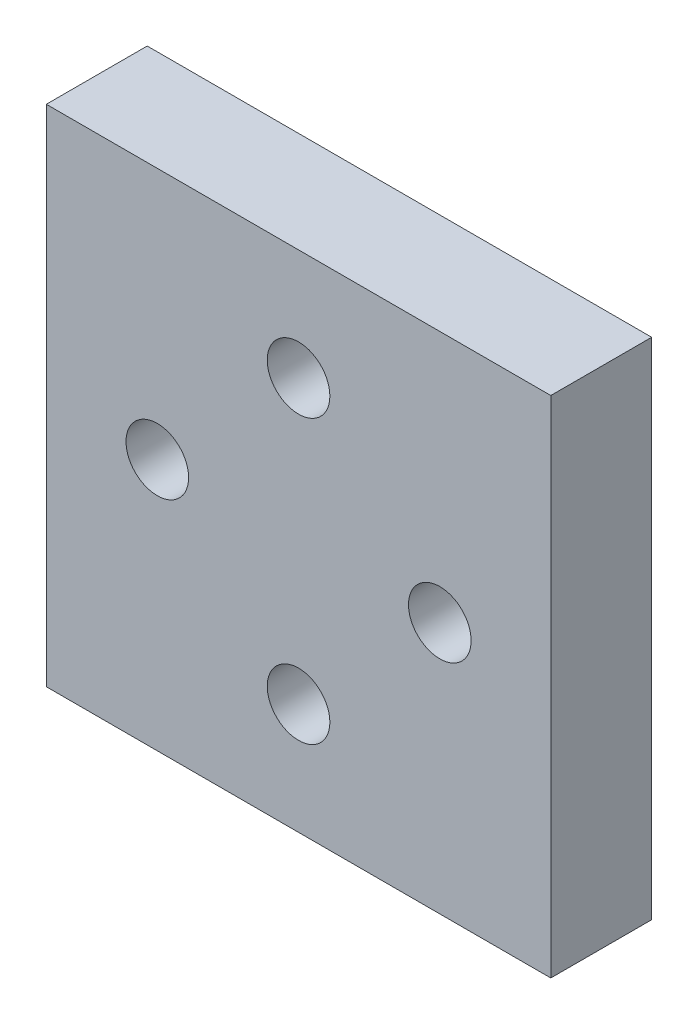
ISO-10303-21;
HEADER;
FILE_DESCRIPTION(('STEP AP214'),'2;1');
FILE_NAME('part.step','',(''),(''),'','','');
FILE_SCHEMA(('AUTOMOTIVE_DESIGN { 1 0 10303 214 1 1 1 1 }'));
ENDSEC;
DATA;
#1=APPLICATION_CONTEXT('core data for automotive mechanical design processes');
#2=APPLICATION_PROTOCOL_DEFINITION('international standard','automotive_design',2000,#1);
#3=PRODUCT_CONTEXT('',#1,'mechanical');
#4=PRODUCT('Part','Part','',(#3));
#5=PRODUCT_RELATED_PRODUCT_CATEGORY('part','',(#4));
#6=PRODUCT_DEFINITION_FORMATION('','',#4);
#7=PRODUCT_DEFINITION_CONTEXT('part definition',#1,'design');
#8=PRODUCT_DEFINITION('design','',#6,#7);
#9=PRODUCT_DEFINITION_SHAPE('','',#8);
#10=(LENGTH_UNIT() NAMED_UNIT(*) SI_UNIT(.MILLI.,.METRE.));
#11=(NAMED_UNIT(*) PLANE_ANGLE_UNIT() SI_UNIT($,.RADIAN.));
#12=(NAMED_UNIT(*) SI_UNIT($,.STERADIAN.) SOLID_ANGLE_UNIT());
#13=UNCERTAINTY_MEASURE_WITH_UNIT(LENGTH_MEASURE(1.E-05),#10,'distance_accuracy_value','');
#14=(GEOMETRIC_REPRESENTATION_CONTEXT(3) GLOBAL_UNCERTAINTY_ASSIGNED_CONTEXT((#13)) GLOBAL_UNIT_ASSIGNED_CONTEXT((#10,
#11,#12)) REPRESENTATION_CONTEXT('',''));
#15=CARTESIAN_POINT('',(0.,0.,0.));
#16=DIRECTION('',(0.,0.,1.));
#17=DIRECTION('',(1.,0.,0.));
#18=AXIS2_PLACEMENT_3D('',#15,#16,#17);
#19=CARTESIAN_POINT('',(0.,0.,5.));
#20=DIRECTION('',(0.,0.,1.));
#21=DIRECTION('',(1.,0.,0.));
#22=AXIS2_PLACEMENT_3D('',#19,#20,#21);
#23=PLANE('',#22);
#24=CARTESIAN_POINT('',(5.94427015220175E-13,-7.,5.));
#25=DIRECTION('',(0.,0.,1.));
#26=DIRECTION('',(1.,0.,0.));
#27=AXIS2_PLACEMENT_3D('',#24,#25,#26);
#28=CIRCLE('',#27,1.55153704903769);
#29=CARTESIAN_POINT('',(1.55153704903828,-7.,5.));
#30=VERTEX_POINT('',#29);
#31=EDGE_CURVE('E121',#30,#30,#28,.T.);
#32=ORIENTED_EDGE('',*,*,#31,.F.);
#33=EDGE_LOOP('',(#32));
#34=FACE_BOUND('',#33,.T.);
#35=CARTESIAN_POINT('',(0.,7.,5.));
#36=DIRECTION('',(0.,0.,1.));
#37=DIRECTION('',(1.,0.,0.));
#38=AXIS2_PLACEMENT_3D('',#35,#36,#37);
#39=CIRCLE('',#38,1.55153704903707);
#40=CARTESIAN_POINT('',(1.55153704903707,7.,5.));
#41=VERTEX_POINT('',#40);
#42=EDGE_CURVE('E100',#41,#41,#39,.T.);
#43=ORIENTED_EDGE('',*,*,#42,.F.);
#44=EDGE_LOOP('',(#43));
#45=FACE_BOUND('',#44,.T.);
#46=DIRECTION('',(0.,1.,0.));
#47=VECTOR('',#46,1.);
#48=CARTESIAN_POINT('',(12.5,12.5,5.));
#49=LINE('',#48,#47);
#50=CARTESIAN_POINT('',(12.5,-12.5,5.));
#51=VERTEX_POINT('',#50);
#52=CARTESIAN_POINT('',(12.5,12.5,5.));
#53=VERTEX_POINT('',#52);
#54=EDGE_CURVE('E85',#51,#53,#49,.T.);
#55=ORIENTED_EDGE('',*,*,#54,.T.);
#56=DIRECTION('',(-1.,0.,0.));
#57=VECTOR('',#56,1.);
#58=CARTESIAN_POINT('',(-12.5,12.5,5.));
#59=LINE('',#58,#57);
#60=CARTESIAN_POINT('',(-12.5,12.5,5.));
#61=VERTEX_POINT('',#60);
#62=EDGE_CURVE('E80',#53,#61,#59,.T.);
#63=ORIENTED_EDGE('',*,*,#62,.T.);
#64=DIRECTION('',(0.,-1.,0.));
#65=VECTOR('',#64,1.);
#66=CARTESIAN_POINT('',(-12.5,12.5,5.));
#67=LINE('',#66,#65);
#68=CARTESIAN_POINT('',(-12.5,-12.5,5.));
#69=VERTEX_POINT('',#68);
#70=EDGE_CURVE('E83',#61,#69,#67,.T.);
#71=ORIENTED_EDGE('',*,*,#70,.T.);
#72=DIRECTION('',(1.,0.,0.));
#73=VECTOR('',#72,1.);
#74=CARTESIAN_POINT('',(-12.5,-12.5,5.));
#75=LINE('',#74,#73);
#76=EDGE_CURVE('E50',#69,#51,#75,.T.);
#77=ORIENTED_EDGE('',*,*,#76,.T.);
#78=EDGE_LOOP('',(#55,#63,#71,#77));
#79=FACE_BOUND('',#78,.T.);
#80=CARTESIAN_POINT('',(7.0000000000003,2.97142069880137E-13,5.));
#81=DIRECTION('',(0.,0.,1.));
#82=DIRECTION('',(1.,0.,0.));
#83=AXIS2_PLACEMENT_3D('',#80,#81,#82);
#84=CIRCLE('',#83,1.55153704903729);
#85=CARTESIAN_POINT('',(8.55153704903759,2.97142069880137E-13,5.));
#86=VERTEX_POINT('',#85);
#87=EDGE_CURVE('E115',#86,#86,#84,.T.);
#88=ORIENTED_EDGE('',*,*,#87,.F.);
#89=EDGE_LOOP('',(#88));
#90=FACE_BOUND('',#89,.T.);
#91=CARTESIAN_POINT('',(-6.9999999999997,-2.97999322639541E-13,5.));
#92=DIRECTION('',(0.,0.,1.));
#93=DIRECTION('',(1.,0.,0.));
#94=AXIS2_PLACEMENT_3D('',#91,#92,#93);
#95=CIRCLE('',#94,1.55153704903751);
#96=CARTESIAN_POINT('',(-5.44846295096219,-2.97999322639541E-13,5.));
#97=VERTEX_POINT('',#96);
#98=EDGE_CURVE('E127',#97,#97,#95,.T.);
#99=ORIENTED_EDGE('',*,*,#98,.F.);
#100=EDGE_LOOP('',(#99));
#101=FACE_BOUND('',#100,.T.);
#102=ADVANCED_FACE('F33',(#34,#45,#79,#90,#101),#23,.T.);
#103=CARTESIAN_POINT('',(0.,0.,0.));
#104=DIRECTION('',(0.,0.,1.));
#105=DIRECTION('',(1.,0.,0.));
#106=AXIS2_PLACEMENT_3D('',#103,#104,#105);
#107=PLANE('',#106);
#108=DIRECTION('',(0.,1.,0.));
#109=VECTOR('',#108,1.);
#110=CARTESIAN_POINT('',(12.5,12.5,0.));
#111=LINE('',#110,#109);
#112=CARTESIAN_POINT('',(12.5,-12.5,0.));
#113=VERTEX_POINT('',#112);
#114=CARTESIAN_POINT('',(12.5,12.5,0.));
#115=VERTEX_POINT('',#114);
#116=EDGE_CURVE('E97',#113,#115,#111,.T.);
#117=ORIENTED_EDGE('',*,*,#116,.F.);
#118=DIRECTION('',(1.,0.,0.));
#119=VECTOR('',#118,1.);
#120=CARTESIAN_POINT('',(-12.5,-12.5,0.));
#121=LINE('',#120,#119);
#122=CARTESIAN_POINT('',(-12.5,-12.5,0.));
#123=VERTEX_POINT('',#122);
#124=EDGE_CURVE('E73',#123,#113,#121,.T.);
#125=ORIENTED_EDGE('',*,*,#124,.F.);
#126=DIRECTION('',(0.,-1.,0.));
#127=VECTOR('',#126,1.);
#128=CARTESIAN_POINT('',(-12.5,12.5,0.));
#129=LINE('',#128,#127);
#130=CARTESIAN_POINT('',(-12.5,12.5,0.));
#131=VERTEX_POINT('',#130);
#132=EDGE_CURVE('E67',#131,#123,#129,.T.);
#133=ORIENTED_EDGE('',*,*,#132,.F.);
#134=DIRECTION('',(-1.,0.,0.));
#135=VECTOR('',#134,1.);
#136=CARTESIAN_POINT('',(-12.5,12.5,0.));
#137=LINE('',#136,#135);
#138=EDGE_CURVE('E89',#115,#131,#137,.T.);
#139=ORIENTED_EDGE('',*,*,#138,.F.);
#140=EDGE_LOOP('',(#117,#125,#133,#139));
#141=FACE_BOUND('',#140,.T.);
#142=CARTESIAN_POINT('',(0.,7.,0.));
#143=DIRECTION('',(0.,0.,1.));
#144=DIRECTION('',(1.,0.,0.));
#145=AXIS2_PLACEMENT_3D('',#142,#143,#144);
#146=CIRCLE('',#145,1.55153704903707);
#147=CARTESIAN_POINT('',(1.55153704903707,7.,0.));
#148=VERTEX_POINT('',#147);
#149=EDGE_CURVE('E112',#148,#148,#146,.T.);
#150=ORIENTED_EDGE('',*,*,#149,.T.);
#151=EDGE_LOOP('',(#150));
#152=FACE_BOUND('',#151,.T.);
#153=CARTESIAN_POINT('',(7.0000000000003,2.97142069880137E-13,0.));
#154=DIRECTION('',(0.,0.,1.));
#155=DIRECTION('',(1.,0.,0.));
#156=AXIS2_PLACEMENT_3D('',#153,#154,#155);
#157=CIRCLE('',#156,1.55153704903729);
#158=CARTESIAN_POINT('',(8.55153704903759,2.97142069880137E-13,0.));
#159=VERTEX_POINT('',#158);
#160=EDGE_CURVE('E118',#159,#159,#157,.T.);
#161=ORIENTED_EDGE('',*,*,#160,.T.);
#162=EDGE_LOOP('',(#161));
#163=FACE_BOUND('',#162,.T.);
#164=CARTESIAN_POINT('',(5.94427015220175E-13,-7.,0.));
#165=DIRECTION('',(0.,0.,1.));
#166=DIRECTION('',(1.,0.,0.));
#167=AXIS2_PLACEMENT_3D('',#164,#165,#166);
#168=CIRCLE('',#167,1.55153704903769);
#169=CARTESIAN_POINT('',(1.55153704903828,-7.,0.));
#170=VERTEX_POINT('',#169);
#171=EDGE_CURVE('E124',#170,#170,#168,.T.);
#172=ORIENTED_EDGE('',*,*,#171,.T.);
#173=EDGE_LOOP('',(#172));
#174=FACE_BOUND('',#173,.T.);
#175=CARTESIAN_POINT('',(-6.9999999999997,-2.97999322639541E-13,0.));
#176=DIRECTION('',(0.,0.,1.));
#177=DIRECTION('',(1.,0.,0.));
#178=AXIS2_PLACEMENT_3D('',#175,#176,#177);
#179=CIRCLE('',#178,1.55153704903751);
#180=CARTESIAN_POINT('',(-5.44846295096219,-2.97999322639541E-13,0.));
#181=VERTEX_POINT('',#180);
#182=EDGE_CURVE('E130',#181,#181,#179,.T.);
#183=ORIENTED_EDGE('',*,*,#182,.T.);
#184=EDGE_LOOP('',(#183));
#185=FACE_BOUND('',#184,.T.);
#186=ADVANCED_FACE('F108',(#141,#152,#163,#174,#185),#107,.F.);
#187=CARTESIAN_POINT('',(12.5,12.5,5.));
#188=DIRECTION('',(-1.,0.,0.));
#189=DIRECTION('',(0.,-1.,0.));
#190=AXIS2_PLACEMENT_3D('',#187,#188,#189);
#191=PLANE('',#190);
#192=ORIENTED_EDGE('',*,*,#116,.T.);
#193=DIRECTION('',(0.,0.,-1.));
#194=VECTOR('',#193,1.);
#195=CARTESIAN_POINT('',(12.5,12.5,5.));
#196=LINE('',#195,#194);
#197=EDGE_CURVE('E11',#53,#115,#196,.T.);
#198=ORIENTED_EDGE('',*,*,#197,.F.);
#199=ORIENTED_EDGE('',*,*,#54,.F.);
#200=DIRECTION('',(0.,0.,-1.));
#201=VECTOR('',#200,1.);
#202=CARTESIAN_POINT('',(12.5,-12.5,5.));
#203=LINE('',#202,#201);
#204=EDGE_CURVE('E93',#51,#113,#203,.T.);
#205=ORIENTED_EDGE('',*,*,#204,.T.);
#206=EDGE_LOOP('',(#192,#198,#199,#205));
#207=FACE_BOUND('',#206,.T.);
#208=ADVANCED_FACE('F35',(#207),#191,.F.);
#209=CARTESIAN_POINT('',(-12.5,12.5,5.));
#210=DIRECTION('',(0.,-1.,0.));
#211=DIRECTION('',(0.,0.,-1.));
#212=AXIS2_PLACEMENT_3D('',#209,#210,#211);
#213=PLANE('',#212);
#214=ORIENTED_EDGE('',*,*,#138,.T.);
#215=DIRECTION('',(0.,0.,-1.));
#216=VECTOR('',#215,1.);
#217=CARTESIAN_POINT('',(-12.5,12.5,5.));
#218=LINE('',#217,#216);
#219=EDGE_CURVE('E42',#61,#131,#218,.T.);
#220=ORIENTED_EDGE('',*,*,#219,.F.);
#221=ORIENTED_EDGE('',*,*,#62,.F.);
#222=ORIENTED_EDGE('',*,*,#197,.T.);
#223=EDGE_LOOP('',(#214,#220,#221,#222));
#224=FACE_BOUND('',#223,.T.);
#225=ADVANCED_FACE('F88',(#224),#213,.F.);
#226=CARTESIAN_POINT('',(-12.5,12.5,5.));
#227=DIRECTION('',(1.,0.,0.));
#228=DIRECTION('',(0.,1.,0.));
#229=AXIS2_PLACEMENT_3D('',#226,#227,#228);
#230=PLANE('',#229);
#231=ORIENTED_EDGE('',*,*,#132,.T.);
#232=DIRECTION('',(0.,0.,-1.));
#233=VECTOR('',#232,1.);
#234=CARTESIAN_POINT('',(-12.5,-12.5,5.));
#235=LINE('',#234,#233);
#236=EDGE_CURVE('E90',#69,#123,#235,.T.);
#237=ORIENTED_EDGE('',*,*,#236,.F.);
#238=ORIENTED_EDGE('',*,*,#70,.F.);
#239=ORIENTED_EDGE('',*,*,#219,.T.);
#240=EDGE_LOOP('',(#231,#237,#238,#239));
#241=FACE_BOUND('',#240,.T.);
#242=ADVANCED_FACE('F91',(#241),#230,.F.);
#243=CARTESIAN_POINT('',(-12.5,-12.5,5.));
#244=DIRECTION('',(0.,1.,0.));
#245=DIRECTION('',(0.,0.,1.));
#246=AXIS2_PLACEMENT_3D('',#243,#244,#245);
#247=PLANE('',#246);
#248=ORIENTED_EDGE('',*,*,#124,.T.);
#249=ORIENTED_EDGE('',*,*,#204,.F.);
#250=ORIENTED_EDGE('',*,*,#76,.F.);
#251=ORIENTED_EDGE('',*,*,#236,.T.);
#252=EDGE_LOOP('',(#248,#249,#250,#251));
#253=FACE_BOUND('',#252,.T.);
#254=ADVANCED_FACE('F105',(#253),#247,.F.);
#255=CARTESIAN_POINT('',(0.,7.,5.));
#256=DIRECTION('',(0.,0.,-1.));
#257=DIRECTION('',(-1.,0.,0.));
#258=AXIS2_PLACEMENT_3D('',#255,#256,#257);
#259=CYLINDRICAL_SURFACE('',#258,1.55153704903707);
#260=ORIENTED_EDGE('',*,*,#42,.T.);
#261=EDGE_LOOP('',(#260));
#262=FACE_BOUND('',#261,.T.);
#263=ORIENTED_EDGE('',*,*,#149,.F.);
#264=EDGE_LOOP('',(#263));
#265=FACE_BOUND('',#264,.T.);
#266=ADVANCED_FACE('F149',(#262,#265),#259,.F.);
#267=CARTESIAN_POINT('',(7.0000000000003,2.97142069880137E-13,5.));
#268=DIRECTION('',(0.,0.,-1.));
#269=DIRECTION('',(-1.,0.,0.));
#270=AXIS2_PLACEMENT_3D('',#267,#268,#269);
#271=CYLINDRICAL_SURFACE('',#270,1.55153704903729);
#272=ORIENTED_EDGE('',*,*,#87,.T.);
#273=EDGE_LOOP('',(#272));
#274=FACE_BOUND('',#273,.T.);
#275=ORIENTED_EDGE('',*,*,#160,.F.);
#276=EDGE_LOOP('',(#275));
#277=FACE_BOUND('',#276,.T.);
#278=ADVANCED_FACE('F189',(#274,#277),#271,.F.);
#279=CARTESIAN_POINT('',(5.94427015220175E-13,-7.,5.));
#280=DIRECTION('',(0.,0.,-1.));
#281=DIRECTION('',(-1.,0.,0.));
#282=AXIS2_PLACEMENT_3D('',#279,#280,#281);
#283=CYLINDRICAL_SURFACE('',#282,1.55153704903769);
#284=ORIENTED_EDGE('',*,*,#31,.T.);
#285=EDGE_LOOP('',(#284));
#286=FACE_BOUND('',#285,.T.);
#287=ORIENTED_EDGE('',*,*,#171,.F.);
#288=EDGE_LOOP('',(#287));
#289=FACE_BOUND('',#288,.T.);
#290=ADVANCED_FACE('F180',(#286,#289),#283,.F.);
#291=CARTESIAN_POINT('',(-6.9999999999997,-2.97999322639541E-13,5.));
#292=DIRECTION('',(0.,0.,-1.));
#293=DIRECTION('',(-1.,0.,0.));
#294=AXIS2_PLACEMENT_3D('',#291,#292,#293);
#295=CYLINDRICAL_SURFACE('',#294,1.55153704903751);
#296=ORIENTED_EDGE('',*,*,#98,.T.);
#297=EDGE_LOOP('',(#296));
#298=FACE_BOUND('',#297,.T.);
#299=ORIENTED_EDGE('',*,*,#182,.F.);
#300=EDGE_LOOP('',(#299));
#301=FACE_BOUND('',#300,.T.);
#302=ADVANCED_FACE('F136',(#298,#301),#295,.F.);
#303=CLOSED_SHELL('',(#102,#186,#208,#225,#242,#254,#266,#278,#290,#302));
#304=MANIFOLD_SOLID_BREP('B2',#303);
#305=ADVANCED_BREP_SHAPE_REPRESENTATION('',(#18,#304),#14);
#306=SHAPE_DEFINITION_REPRESENTATION(#9,#305);
ENDSEC;
END-ISO-10303-21;
